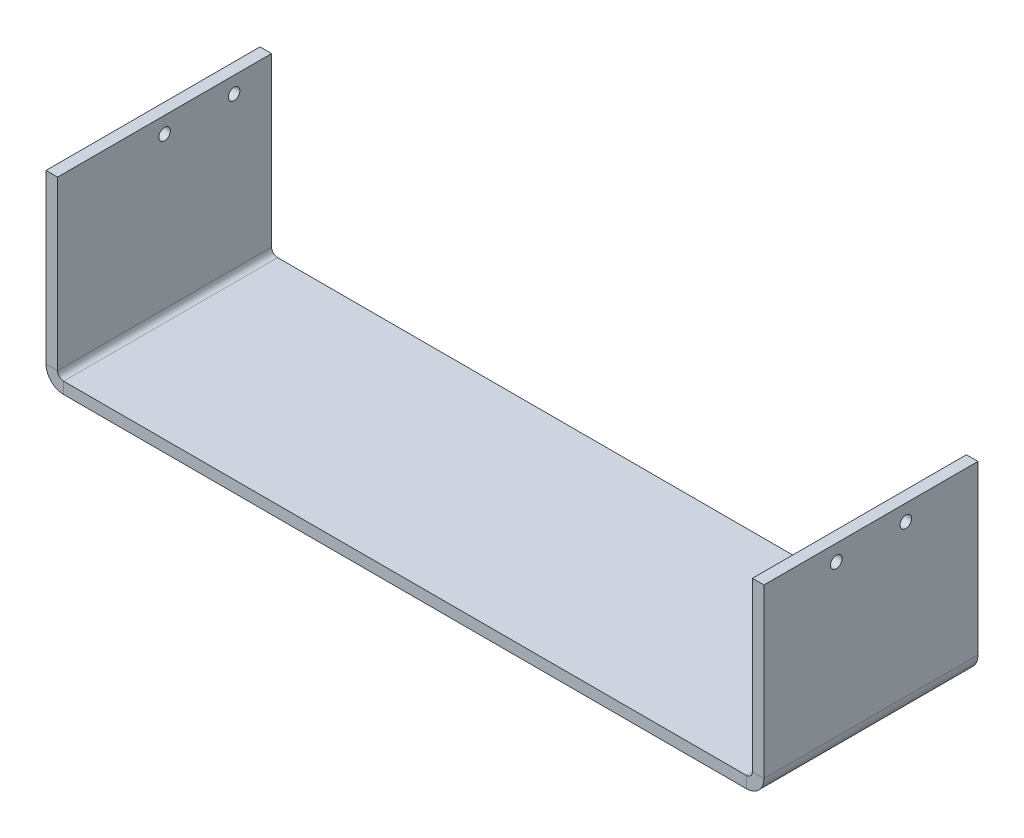
ISO-10303-21;
HEADER;
FILE_DESCRIPTION(('STEP AP214'),'2;1');
FILE_NAME('part.step','',(''),(''),'','','');
FILE_SCHEMA(('AUTOMOTIVE_DESIGN { 1 0 10303 214 1 1 1 1 }'));
ENDSEC;
DATA;
#1=APPLICATION_CONTEXT('core data for automotive mechanical design processes');
#2=APPLICATION_PROTOCOL_DEFINITION('international standard','automotive_design',2000,#1);
#3=PRODUCT_CONTEXT('',#1,'mechanical');
#4=PRODUCT('Part','Part','',(#3));
#5=PRODUCT_RELATED_PRODUCT_CATEGORY('part','',(#4));
#6=PRODUCT_DEFINITION_FORMATION('','',#4);
#7=PRODUCT_DEFINITION_CONTEXT('part definition',#1,'design');
#8=PRODUCT_DEFINITION('design','',#6,#7);
#9=PRODUCT_DEFINITION_SHAPE('','',#8);
#10=(LENGTH_UNIT() NAMED_UNIT(*) SI_UNIT(.MILLI.,.METRE.));
#11=(NAMED_UNIT(*) PLANE_ANGLE_UNIT() SI_UNIT($,.RADIAN.));
#12=(NAMED_UNIT(*) SI_UNIT($,.STERADIAN.) SOLID_ANGLE_UNIT());
#13=UNCERTAINTY_MEASURE_WITH_UNIT(LENGTH_MEASURE(1.E-05),#10,'distance_accuracy_value','');
#14=(GEOMETRIC_REPRESENTATION_CONTEXT(3) GLOBAL_UNCERTAINTY_ASSIGNED_CONTEXT((#13)) GLOBAL_UNIT_ASSIGNED_CONTEXT((#10,
#11,#12)) REPRESENTATION_CONTEXT('',''));
#15=CARTESIAN_POINT('',(0.,0.,0.));
#16=DIRECTION('',(0.,0.,1.));
#17=DIRECTION('',(1.,0.,0.));
#18=AXIS2_PLACEMENT_3D('',#15,#16,#17);
#19=CARTESIAN_POINT('',(122.4,0.,92.4));
#20=DIRECTION('',(0.,0.,1.));
#21=DIRECTION('',(1.,0.,0.));
#22=AXIS2_PLACEMENT_3D('',#19,#20,#21);
#23=PLANE('',#22);
#24=DIRECTION('',(0.,1.,0.));
#25=VECTOR('',#24,1.);
#26=CARTESIAN_POINT('',(122.4,0.,92.4));
#27=LINE('',#26,#25);
#28=CARTESIAN_POINT('',(122.4,0.,92.4));
#29=VERTEX_POINT('',#28);
#30=CARTESIAN_POINT('',(122.4,5.00000000000002,92.4));
#31=VERTEX_POINT('',#30);
#32=EDGE_CURVE('E11',#29,#31,#27,.T.);
#33=ORIENTED_EDGE('',*,*,#32,.F.);
#34=CARTESIAN_POINT('',(122.4,7.60000000000002,92.4));
#35=DIRECTION('',(0.,0.,1.));
#36=DIRECTION('',(1.,0.,0.));
#37=AXIS2_PLACEMENT_3D('',#34,#35,#36);
#38=CIRCLE('',#37,7.6);
#39=CARTESIAN_POINT('',(130.,7.60000000000002,92.4));
#40=VERTEX_POINT('',#39);
#41=EDGE_CURVE('E270',#40,#29,#38,.F.);
#42=ORIENTED_EDGE('',*,*,#41,.F.);
#43=DIRECTION('',(1.,0.,0.));
#44=VECTOR('',#43,1.);
#45=CARTESIAN_POINT('',(125.,7.60000000000002,92.4));
#46=LINE('',#45,#44);
#47=CARTESIAN_POINT('',(125.,7.60000000000002,92.4));
#48=VERTEX_POINT('',#47);
#49=EDGE_CURVE('E52',#48,#40,#46,.T.);
#50=ORIENTED_EDGE('',*,*,#49,.F.);
#51=CARTESIAN_POINT('',(122.4,7.60000000000002,92.4));
#52=DIRECTION('',(0.,0.,1.));
#53=DIRECTION('',(1.,0.,0.));
#54=AXIS2_PLACEMENT_3D('',#51,#52,#53);
#55=CIRCLE('',#54,2.6);
#56=EDGE_CURVE('E153',#48,#31,#55,.F.);
#57=ORIENTED_EDGE('',*,*,#56,.T.);
#58=EDGE_LOOP('',(#33,#42,#50,#57));
#59=FACE_BOUND('',#58,.T.);
#60=ADVANCED_FACE('F43',(#59),#23,.T.);
#61=CARTESIAN_POINT('',(125.,7.60000000000002,92.4));
#62=DIRECTION('',(0.,0.,1.));
#63=DIRECTION('',(1.,0.,0.));
#64=AXIS2_PLACEMENT_3D('',#61,#62,#63);
#65=PLANE('',#64);
#66=DIRECTION('',(-1.,0.,0.));
#67=VECTOR('',#66,1.);
#68=CARTESIAN_POINT('',(-99.9999999999999,0.,92.4));
#69=LINE('',#68,#67);
#70=CARTESIAN_POINT('',(-172.4,0.,92.4));
#71=VERTEX_POINT('',#70);
#72=EDGE_CURVE('E148',#29,#71,#69,.T.);
#73=ORIENTED_EDGE('',*,*,#72,.F.);
#74=ORIENTED_EDGE('',*,*,#32,.T.);
#75=DIRECTION('',(-1.,0.,0.));
#76=VECTOR('',#75,1.);
#77=CARTESIAN_POINT('',(130.,5.00000000000002,92.4));
#78=LINE('',#77,#76);
#79=CARTESIAN_POINT('',(-172.4,5.00000000000003,92.4));
#80=VERTEX_POINT('',#79);
#81=EDGE_CURVE('E145',#31,#80,#78,.T.);
#82=ORIENTED_EDGE('',*,*,#81,.T.);
#83=DIRECTION('',(0.,-1.,0.));
#84=VECTOR('',#83,1.);
#85=CARTESIAN_POINT('',(-172.4,5.00000000000003,92.4));
#86=LINE('',#85,#84);
#87=EDGE_CURVE('E235',#80,#71,#86,.T.);
#88=ORIENTED_EDGE('',*,*,#87,.T.);
#89=EDGE_LOOP('',(#73,#74,#82,#88));
#90=FACE_BOUND('',#89,.T.);
#91=ADVANCED_FACE('F143',(#90),#65,.T.);
#92=CARTESIAN_POINT('',(130.,7.60000000000002,0.));
#93=DIRECTION('',(0.,0.,-1.));
#94=DIRECTION('',(-1.,0.,0.));
#95=AXIS2_PLACEMENT_3D('',#92,#93,#94);
#96=PLANE('',#95);
#97=DIRECTION('',(-1.,0.,0.));
#98=VECTOR('',#97,1.);
#99=CARTESIAN_POINT('',(130.,7.60000000000002,0.));
#100=LINE('',#99,#98);
#101=CARTESIAN_POINT('',(130.,7.60000000000002,0.));
#102=VERTEX_POINT('',#101);
#103=CARTESIAN_POINT('',(125.,7.60000000000002,0.));
#104=VERTEX_POINT('',#103);
#105=EDGE_CURVE('E240',#102,#104,#100,.T.);
#106=ORIENTED_EDGE('',*,*,#105,.F.);
#107=CARTESIAN_POINT('',(122.4,7.60000000000002,0.));
#108=DIRECTION('',(0.,0.,1.));
#109=DIRECTION('',(1.,0.,0.));
#110=AXIS2_PLACEMENT_3D('',#107,#108,#109);
#111=CIRCLE('',#110,7.6);
#112=CARTESIAN_POINT('',(122.4,0.,0.));
#113=VERTEX_POINT('',#112);
#114=EDGE_CURVE('E192',#102,#113,#111,.F.);
#115=ORIENTED_EDGE('',*,*,#114,.T.);
#116=DIRECTION('',(0.,-1.,0.));
#117=VECTOR('',#116,1.);
#118=CARTESIAN_POINT('',(122.4,5.00000000000002,0.));
#119=LINE('',#118,#117);
#120=CARTESIAN_POINT('',(122.4,5.00000000000002,0.));
#121=VERTEX_POINT('',#120);
#122=EDGE_CURVE('E238',#121,#113,#119,.T.);
#123=ORIENTED_EDGE('',*,*,#122,.F.);
#124=CARTESIAN_POINT('',(122.4,7.60000000000002,0.));
#125=DIRECTION('',(0.,0.,1.));
#126=DIRECTION('',(1.,0.,0.));
#127=AXIS2_PLACEMENT_3D('',#124,#125,#126);
#128=CIRCLE('',#127,2.6);
#129=EDGE_CURVE('E165',#104,#121,#128,.F.);
#130=ORIENTED_EDGE('',*,*,#129,.F.);
#131=EDGE_LOOP('',(#106,#115,#123,#130));
#132=FACE_BOUND('',#131,.T.);
#133=ADVANCED_FACE('F289',(#132),#96,.T.);
#134=CARTESIAN_POINT('',(122.4,5.00000000000002,0.));
#135=DIRECTION('',(0.,0.,-1.));
#136=DIRECTION('',(-1.,0.,0.));
#137=AXIS2_PLACEMENT_3D('',#134,#135,#136);
#138=PLANE('',#137);
#139=DIRECTION('',(0.,-1.,0.));
#140=VECTOR('',#139,1.);
#141=CARTESIAN_POINT('',(130.,80.,0.));
#142=LINE('',#141,#140);
#143=CARTESIAN_POINT('',(130.,80.,0.));
#144=VERTEX_POINT('',#143);
#145=EDGE_CURVE('E195',#144,#102,#142,.T.);
#146=ORIENTED_EDGE('',*,*,#145,.T.);
#147=ORIENTED_EDGE('',*,*,#105,.T.);
#148=DIRECTION('',(0.,-1.,0.));
#149=VECTOR('',#148,1.);
#150=CARTESIAN_POINT('',(125.,80.,0.));
#151=LINE('',#150,#149);
#152=CARTESIAN_POINT('',(125.,80.,0.));
#153=VERTEX_POINT('',#152);
#154=EDGE_CURVE('E201',#153,#104,#151,.T.);
#155=ORIENTED_EDGE('',*,*,#154,.F.);
#156=DIRECTION('',(1.,0.,0.));
#157=VECTOR('',#156,1.);
#158=CARTESIAN_POINT('',(125.,80.,0.));
#159=LINE('',#158,#157);
#160=EDGE_CURVE('E198',#153,#144,#159,.T.);
#161=ORIENTED_EDGE('',*,*,#160,.T.);
#162=EDGE_LOOP('',(#146,#147,#155,#161));
#163=FACE_BOUND('',#162,.T.);
#164=ADVANCED_FACE('F325',(#163),#138,.T.);
#165=CARTESIAN_POINT('',(-180.,7.60000000000003,92.4));
#166=DIRECTION('',(0.,0.,1.));
#167=DIRECTION('',(1.,0.,0.));
#168=AXIS2_PLACEMENT_3D('',#165,#166,#167);
#169=PLANE('',#168);
#170=DIRECTION('',(1.,0.,0.));
#171=VECTOR('',#170,1.);
#172=CARTESIAN_POINT('',(-180.,7.60000000000003,92.4));
#173=LINE('',#172,#171);
#174=CARTESIAN_POINT('',(-180.,7.60000000000003,92.4));
#175=VERTEX_POINT('',#174);
#176=CARTESIAN_POINT('',(-175.,7.60000000000003,92.4));
#177=VERTEX_POINT('',#176);
#178=EDGE_CURVE('E61',#175,#177,#173,.T.);
#179=ORIENTED_EDGE('',*,*,#178,.F.);
#180=CARTESIAN_POINT('',(-172.4,7.60000000000003,92.4));
#181=DIRECTION('',(0.,0.,1.));
#182=DIRECTION('',(1.,0.,0.));
#183=AXIS2_PLACEMENT_3D('',#180,#181,#182);
#184=CIRCLE('',#183,7.6);
#185=EDGE_CURVE('E266',#71,#175,#184,.F.);
#186=ORIENTED_EDGE('',*,*,#185,.F.);
#187=ORIENTED_EDGE('',*,*,#87,.F.);
#188=CARTESIAN_POINT('',(-172.4,7.60000000000003,92.4));
#189=DIRECTION('',(0.,0.,1.));
#190=DIRECTION('',(1.,0.,0.));
#191=AXIS2_PLACEMENT_3D('',#188,#189,#190);
#192=CIRCLE('',#191,2.6);
#193=EDGE_CURVE('E173',#80,#177,#192,.F.);
#194=ORIENTED_EDGE('',*,*,#193,.T.);
#195=EDGE_LOOP('',(#179,#186,#187,#194));
#196=FACE_BOUND('',#195,.T.);
#197=ADVANCED_FACE('F318',(#196),#169,.T.);
#198=CARTESIAN_POINT('',(-172.4,5.00000000000003,92.4));
#199=DIRECTION('',(0.,0.,1.));
#200=DIRECTION('',(1.,0.,0.));
#201=AXIS2_PLACEMENT_3D('',#198,#199,#200);
#202=PLANE('',#201);
#203=DIRECTION('',(0.,1.,0.));
#204=VECTOR('',#203,1.);
#205=CARTESIAN_POINT('',(-180.,0.,92.4));
#206=LINE('',#205,#204);
#207=CARTESIAN_POINT('',(-180.,80.,92.4));
#208=VERTEX_POINT('',#207);
#209=EDGE_CURVE('E263',#175,#208,#206,.T.);
#210=ORIENTED_EDGE('',*,*,#209,.F.);
#211=ORIENTED_EDGE('',*,*,#178,.T.);
#212=DIRECTION('',(0.,1.,0.));
#213=VECTOR('',#212,1.);
#214=CARTESIAN_POINT('',(-175.,0.,92.4));
#215=LINE('',#214,#213);
#216=CARTESIAN_POINT('',(-175.,80.,92.4));
#217=VERTEX_POINT('',#216);
#218=EDGE_CURVE('E115',#177,#217,#215,.T.);
#219=ORIENTED_EDGE('',*,*,#218,.T.);
#220=DIRECTION('',(1.,0.,0.));
#221=VECTOR('',#220,1.);
#222=CARTESIAN_POINT('',(-180.,80.,92.4));
#223=LINE('',#222,#221);
#224=EDGE_CURVE('E260',#208,#217,#223,.T.);
#225=ORIENTED_EDGE('',*,*,#224,.F.);
#226=EDGE_LOOP('',(#210,#211,#219,#225));
#227=FACE_BOUND('',#226,.T.);
#228=ADVANCED_FACE('F316',(#227),#202,.T.);
#229=CARTESIAN_POINT('',(-172.4,0.,0.));
#230=DIRECTION('',(0.,0.,-1.));
#231=DIRECTION('',(-1.,0.,0.));
#232=AXIS2_PLACEMENT_3D('',#229,#230,#231);
#233=PLANE('',#232);
#234=DIRECTION('',(0.,1.,0.));
#235=VECTOR('',#234,1.);
#236=CARTESIAN_POINT('',(-172.4,0.,0.));
#237=LINE('',#236,#235);
#238=CARTESIAN_POINT('',(-172.4,0.,0.));
#239=VERTEX_POINT('',#238);
#240=CARTESIAN_POINT('',(-172.4,5.00000000000003,0.));
#241=VERTEX_POINT('',#240);
#242=EDGE_CURVE('E102',#239,#241,#237,.T.);
#243=ORIENTED_EDGE('',*,*,#242,.F.);
#244=CARTESIAN_POINT('',(-172.4,7.60000000000003,0.));
#245=DIRECTION('',(0.,0.,1.));
#246=DIRECTION('',(1.,0.,0.));
#247=AXIS2_PLACEMENT_3D('',#244,#245,#246);
#248=CIRCLE('',#247,7.6);
#249=CARTESIAN_POINT('',(-180.,7.60000000000003,0.));
#250=VERTEX_POINT('',#249);
#251=EDGE_CURVE('E188',#239,#250,#248,.F.);
#252=ORIENTED_EDGE('',*,*,#251,.T.);
#253=DIRECTION('',(-1.,0.,0.));
#254=VECTOR('',#253,1.);
#255=CARTESIAN_POINT('',(-175.,7.60000000000003,0.));
#256=LINE('',#255,#254);
#257=CARTESIAN_POINT('',(-175.,7.60000000000003,0.));
#258=VERTEX_POINT('',#257);
#259=EDGE_CURVE('E109',#258,#250,#256,.T.);
#260=ORIENTED_EDGE('',*,*,#259,.F.);
#261=CARTESIAN_POINT('',(-172.4,7.60000000000003,0.));
#262=DIRECTION('',(0.,0.,1.));
#263=DIRECTION('',(1.,0.,0.));
#264=AXIS2_PLACEMENT_3D('',#261,#262,#263);
#265=CIRCLE('',#264,2.6);
#266=EDGE_CURVE('E207',#241,#258,#265,.F.);
#267=ORIENTED_EDGE('',*,*,#266,.F.);
#268=EDGE_LOOP('',(#243,#252,#260,#267));
#269=FACE_BOUND('',#268,.T.);
#270=ADVANCED_FACE('F295',(#269),#233,.T.);
#271=CARTESIAN_POINT('',(-175.,7.60000000000003,0.));
#272=DIRECTION('',(0.,0.,-1.));
#273=DIRECTION('',(-1.,0.,0.));
#274=AXIS2_PLACEMENT_3D('',#271,#272,#273);
#275=PLANE('',#274);
#276=DIRECTION('',(-1.,0.,0.));
#277=VECTOR('',#276,1.);
#278=CARTESIAN_POINT('',(130.,0.,0.));
#279=LINE('',#278,#277);
#280=EDGE_CURVE('E190',#113,#239,#279,.T.);
#281=ORIENTED_EDGE('',*,*,#280,.T.);
#282=ORIENTED_EDGE('',*,*,#242,.T.);
#283=DIRECTION('',(1.,0.,0.));
#284=VECTOR('',#283,1.);
#285=CARTESIAN_POINT('',(-99.9999999999999,5.00000000000003,0.));
#286=LINE('',#285,#284);
#287=EDGE_CURVE('E205',#121,#241,#286,.F.);
#288=ORIENTED_EDGE('',*,*,#287,.F.);
#289=ORIENTED_EDGE('',*,*,#122,.T.);
#290=EDGE_LOOP('',(#281,#282,#288,#289));
#291=FACE_BOUND('',#290,.T.);
#292=ADVANCED_FACE('F291',(#291),#275,.T.);
#293=CARTESIAN_POINT('',(-175.,0.,92.4));
#294=DIRECTION('',(-1.,0.,0.));
#295=DIRECTION('',(0.,0.,1.));
#296=AXIS2_PLACEMENT_3D('',#293,#294,#295);
#297=PLANE('',#296);
#298=CARTESIAN_POINT('',(-175.,73.,16.2));
#299=DIRECTION('',(-1.,0.,0.));
#300=DIRECTION('',(0.,0.,1.));
#301=AXIS2_PLACEMENT_3D('',#298,#299,#300);
#302=CIRCLE('',#301,2.5);
#303=CARTESIAN_POINT('',(-175.,73.,18.7));
#304=VERTEX_POINT('',#303);
#305=EDGE_CURVE('E254',#304,#304,#302,.T.);
#306=ORIENTED_EDGE('',*,*,#305,.T.);
#307=EDGE_LOOP('',(#306));
#308=FACE_BOUND('',#307,.T.);
#309=CARTESIAN_POINT('',(-175.,73.,46.2));
#310=DIRECTION('',(-1.,0.,0.));
#311=DIRECTION('',(0.,0.,1.));
#312=AXIS2_PLACEMENT_3D('',#309,#310,#311);
#313=CIRCLE('',#312,2.5);
#314=CARTESIAN_POINT('',(-175.,73.,48.7));
#315=VERTEX_POINT('',#314);
#316=EDGE_CURVE('E616',#315,#315,#313,.T.);
#317=ORIENTED_EDGE('',*,*,#316,.T.);
#318=EDGE_LOOP('',(#317));
#319=FACE_BOUND('',#318,.T.);
#320=DIRECTION('',(0.,1.,0.));
#321=VECTOR('',#320,1.);
#322=CARTESIAN_POINT('',(-175.,0.,0.));
#323=LINE('',#322,#321);
#324=CARTESIAN_POINT('',(-175.,80.,0.));
#325=VERTEX_POINT('',#324);
#326=EDGE_CURVE('E179',#258,#325,#323,.T.);
#327=ORIENTED_EDGE('',*,*,#326,.T.);
#328=DIRECTION('',(0.,0.,-1.));
#329=VECTOR('',#328,1.);
#330=CARTESIAN_POINT('',(-175.,80.,92.4));
#331=LINE('',#330,#329);
#332=EDGE_CURVE('E231',#217,#325,#331,.T.);
#333=ORIENTED_EDGE('',*,*,#332,.F.);
#334=ORIENTED_EDGE('',*,*,#218,.F.);
#335=DIRECTION('',(0.,0.,-1.));
#336=VECTOR('',#335,1.);
#337=CARTESIAN_POINT('',(-175.,7.60000000000003,92.4));
#338=LINE('',#337,#336);
#339=EDGE_CURVE('E175',#177,#258,#338,.T.);
#340=ORIENTED_EDGE('',*,*,#339,.T.);
#341=EDGE_LOOP('',(#327,#333,#334,#340));
#342=FACE_BOUND('',#341,.T.);
#343=ADVANCED_FACE('F313',(#308,#319,#342),#297,.F.);
#344=CARTESIAN_POINT('',(-180.,80.,92.4));
#345=DIRECTION('',(0.,1.,0.));
#346=DIRECTION('',(0.,0.,1.));
#347=AXIS2_PLACEMENT_3D('',#344,#345,#346);
#348=PLANE('',#347);
#349=DIRECTION('',(1.,0.,0.));
#350=VECTOR('',#349,1.);
#351=CARTESIAN_POINT('',(-180.,80.,0.));
#352=LINE('',#351,#350);
#353=CARTESIAN_POINT('',(-180.,80.,0.));
#354=VERTEX_POINT('',#353);
#355=EDGE_CURVE('E182',#354,#325,#352,.T.);
#356=ORIENTED_EDGE('',*,*,#355,.F.);
#357=DIRECTION('',(0.,0.,-1.));
#358=VECTOR('',#357,1.);
#359=CARTESIAN_POINT('',(-180.,80.,92.4));
#360=LINE('',#359,#358);
#361=EDGE_CURVE('E229',#208,#354,#360,.T.);
#362=ORIENTED_EDGE('',*,*,#361,.F.);
#363=ORIENTED_EDGE('',*,*,#224,.T.);
#364=ORIENTED_EDGE('',*,*,#332,.T.);
#365=EDGE_LOOP('',(#356,#362,#363,#364));
#366=FACE_BOUND('',#365,.T.);
#367=ADVANCED_FACE('F315',(#366),#348,.T.);
#368=CARTESIAN_POINT('',(-180.,0.,92.4));
#369=DIRECTION('',(-1.,0.,0.));
#370=DIRECTION('',(0.,0.,1.));
#371=AXIS2_PLACEMENT_3D('',#368,#369,#370);
#372=PLANE('',#371);
#373=CARTESIAN_POINT('',(-180.,73.,16.2));
#374=DIRECTION('',(-1.,0.,0.));
#375=DIRECTION('',(0.,0.,1.));
#376=AXIS2_PLACEMENT_3D('',#373,#374,#375);
#377=CIRCLE('',#376,2.5);
#378=CARTESIAN_POINT('',(-180.,73.,18.7));
#379=VERTEX_POINT('',#378);
#380=EDGE_CURVE('E613',#379,#379,#377,.T.);
#381=ORIENTED_EDGE('',*,*,#380,.F.);
#382=EDGE_LOOP('',(#381));
#383=FACE_BOUND('',#382,.T.);
#384=CARTESIAN_POINT('',(-180.,73.,46.2));
#385=DIRECTION('',(-1.,0.,0.));
#386=DIRECTION('',(0.,0.,1.));
#387=AXIS2_PLACEMENT_3D('',#384,#385,#386);
#388=CIRCLE('',#387,2.5);
#389=CARTESIAN_POINT('',(-180.,73.,48.7));
#390=VERTEX_POINT('',#389);
#391=EDGE_CURVE('E620',#390,#390,#388,.T.);
#392=ORIENTED_EDGE('',*,*,#391,.F.);
#393=EDGE_LOOP('',(#392));
#394=FACE_BOUND('',#393,.T.);
#395=DIRECTION('',(0.,1.,0.));
#396=VECTOR('',#395,1.);
#397=CARTESIAN_POINT('',(-180.,0.,0.));
#398=LINE('',#397,#396);
#399=EDGE_CURVE('E185',#250,#354,#398,.T.);
#400=ORIENTED_EDGE('',*,*,#399,.F.);
#401=DIRECTION('',(0.,0.,-1.));
#402=VECTOR('',#401,1.);
#403=CARTESIAN_POINT('',(-180.,7.60000000000003,92.4));
#404=LINE('',#403,#402);
#405=EDGE_CURVE('E226',#175,#250,#404,.T.);
#406=ORIENTED_EDGE('',*,*,#405,.F.);
#407=ORIENTED_EDGE('',*,*,#209,.T.);
#408=ORIENTED_EDGE('',*,*,#361,.T.);
#409=EDGE_LOOP('',(#400,#406,#407,#408));
#410=FACE_BOUND('',#409,.T.);
#411=ADVANCED_FACE('F307',(#383,#394,#410),#372,.T.);
#412=CARTESIAN_POINT('',(-172.4,7.60000000000003,92.4));
#413=DIRECTION('',(0.,0.,-1.));
#414=DIRECTION('',(-1.,0.,0.));
#415=AXIS2_PLACEMENT_3D('',#412,#413,#414);
#416=CYLINDRICAL_SURFACE('',#415,7.6);
#417=ORIENTED_EDGE('',*,*,#251,.F.);
#418=DIRECTION('',(0.,0.,-1.));
#419=VECTOR('',#418,1.);
#420=CARTESIAN_POINT('',(-172.4,0.,92.4));
#421=LINE('',#420,#419);
#422=EDGE_CURVE('E223',#71,#239,#421,.T.);
#423=ORIENTED_EDGE('',*,*,#422,.F.);
#424=ORIENTED_EDGE('',*,*,#185,.T.);
#425=ORIENTED_EDGE('',*,*,#405,.T.);
#426=EDGE_LOOP('',(#417,#423,#424,#425));
#427=FACE_BOUND('',#426,.T.);
#428=ADVANCED_FACE('F303',(#427),#416,.T.);
#429=CARTESIAN_POINT('',(130.,0.,92.4));
#430=DIRECTION('',(0.,-1.,0.));
#431=DIRECTION('',(1.,0.,0.));
#432=AXIS2_PLACEMENT_3D('',#429,#430,#431);
#433=PLANE('',#432);
#434=ORIENTED_EDGE('',*,*,#280,.F.);
#435=DIRECTION('',(0.,0.,-1.));
#436=VECTOR('',#435,1.);
#437=CARTESIAN_POINT('',(122.4,0.,92.4));
#438=LINE('',#437,#436);
#439=EDGE_CURVE('E220',#29,#113,#438,.T.);
#440=ORIENTED_EDGE('',*,*,#439,.F.);
#441=ORIENTED_EDGE('',*,*,#72,.T.);
#442=ORIENTED_EDGE('',*,*,#422,.T.);
#443=EDGE_LOOP('',(#434,#440,#441,#442));
#444=FACE_BOUND('',#443,.T.);
#445=ADVANCED_FACE('F300',(#444),#433,.T.);
#446=CARTESIAN_POINT('',(122.4,7.60000000000002,92.4));
#447=DIRECTION('',(0.,0.,-1.));
#448=DIRECTION('',(-1.,0.,0.));
#449=AXIS2_PLACEMENT_3D('',#446,#447,#448);
#450=CYLINDRICAL_SURFACE('',#449,7.6);
#451=ORIENTED_EDGE('',*,*,#114,.F.);
#452=DIRECTION('',(0.,0.,-1.));
#453=VECTOR('',#452,1.);
#454=CARTESIAN_POINT('',(130.,7.60000000000002,92.4));
#455=LINE('',#454,#453);
#456=EDGE_CURVE('E217',#40,#102,#455,.T.);
#457=ORIENTED_EDGE('',*,*,#456,.F.);
#458=ORIENTED_EDGE('',*,*,#41,.T.);
#459=ORIENTED_EDGE('',*,*,#439,.T.);
#460=EDGE_LOOP('',(#451,#457,#458,#459));
#461=FACE_BOUND('',#460,.T.);
#462=ADVANCED_FACE('F346',(#461),#450,.T.);
#463=CARTESIAN_POINT('',(130.,80.,92.4));
#464=DIRECTION('',(1.,0.,0.));
#465=DIRECTION('',(0.,1.,0.));
#466=AXIS2_PLACEMENT_3D('',#463,#464,#465);
#467=PLANE('',#466);
#468=CARTESIAN_POINT('',(130.,73.,61.2));
#469=DIRECTION('',(1.,0.,0.));
#470=DIRECTION('',(0.,1.,0.));
#471=AXIS2_PLACEMENT_3D('',#468,#469,#470);
#472=CIRCLE('',#471,2.5);
#473=CARTESIAN_POINT('',(130.,75.5,61.2));
#474=VERTEX_POINT('',#473);
#475=EDGE_CURVE('E244',#474,#474,#472,.T.);
#476=ORIENTED_EDGE('',*,*,#475,.F.);
#477=EDGE_LOOP('',(#476));
#478=FACE_BOUND('',#477,.T.);
#479=CARTESIAN_POINT('',(130.,73.,31.2));
#480=DIRECTION('',(1.,0.,0.));
#481=DIRECTION('',(0.,1.,0.));
#482=AXIS2_PLACEMENT_3D('',#479,#480,#481);
#483=CIRCLE('',#482,2.5);
#484=CARTESIAN_POINT('',(130.,75.5,31.2));
#485=VERTEX_POINT('',#484);
#486=EDGE_CURVE('E249',#485,#485,#483,.T.);
#487=ORIENTED_EDGE('',*,*,#486,.F.);
#488=EDGE_LOOP('',(#487));
#489=FACE_BOUND('',#488,.T.);
#490=ORIENTED_EDGE('',*,*,#145,.F.);
#491=DIRECTION('',(0.,0.,-1.));
#492=VECTOR('',#491,1.);
#493=CARTESIAN_POINT('',(130.,80.,92.4));
#494=LINE('',#493,#492);
#495=CARTESIAN_POINT('',(130.,80.,92.4));
#496=VERTEX_POINT('',#495);
#497=EDGE_CURVE('E215',#496,#144,#494,.T.);
#498=ORIENTED_EDGE('',*,*,#497,.F.);
#499=DIRECTION('',(0.,-1.,0.));
#500=VECTOR('',#499,1.);
#501=CARTESIAN_POINT('',(130.,80.,92.4));
#502=LINE('',#501,#500);
#503=EDGE_CURVE('E273',#496,#40,#502,.T.);
#504=ORIENTED_EDGE('',*,*,#503,.T.);
#505=ORIENTED_EDGE('',*,*,#456,.T.);
#506=EDGE_LOOP('',(#490,#498,#504,#505));
#507=FACE_BOUND('',#506,.T.);
#508=ADVANCED_FACE('F344',(#478,#489,#507),#467,.T.);
#509=CARTESIAN_POINT('',(125.,80.,92.4));
#510=DIRECTION('',(0.,1.,0.));
#511=DIRECTION('',(0.,0.,1.));
#512=AXIS2_PLACEMENT_3D('',#509,#510,#511);
#513=PLANE('',#512);
#514=ORIENTED_EDGE('',*,*,#160,.F.);
#515=DIRECTION('',(0.,0.,-1.));
#516=VECTOR('',#515,1.);
#517=CARTESIAN_POINT('',(125.,80.,92.4));
#518=LINE('',#517,#516);
#519=CARTESIAN_POINT('',(125.,80.,92.4));
#520=VERTEX_POINT('',#519);
#521=EDGE_CURVE('E213',#520,#153,#518,.T.);
#522=ORIENTED_EDGE('',*,*,#521,.F.);
#523=DIRECTION('',(1.,0.,0.));
#524=VECTOR('',#523,1.);
#525=CARTESIAN_POINT('',(125.,80.,92.4));
#526=LINE('',#525,#524);
#527=EDGE_CURVE('E276',#520,#496,#526,.T.);
#528=ORIENTED_EDGE('',*,*,#527,.T.);
#529=ORIENTED_EDGE('',*,*,#497,.T.);
#530=EDGE_LOOP('',(#514,#522,#528,#529));
#531=FACE_BOUND('',#530,.T.);
#532=ADVANCED_FACE('F354',(#531),#513,.T.);
#533=CARTESIAN_POINT('',(125.,80.,92.4));
#534=DIRECTION('',(1.,0.,0.));
#535=DIRECTION('',(0.,1.,0.));
#536=AXIS2_PLACEMENT_3D('',#533,#534,#535);
#537=PLANE('',#536);
#538=CARTESIAN_POINT('',(125.,73.,61.2));
#539=DIRECTION('',(1.,0.,0.));
#540=DIRECTION('',(0.,1.,0.));
#541=AXIS2_PLACEMENT_3D('',#538,#539,#540);
#542=CIRCLE('',#541,2.5);
#543=CARTESIAN_POINT('',(125.,75.5,61.2));
#544=VERTEX_POINT('',#543);
#545=EDGE_CURVE('E46',#544,#544,#542,.T.);
#546=ORIENTED_EDGE('',*,*,#545,.T.);
#547=EDGE_LOOP('',(#546));
#548=FACE_BOUND('',#547,.T.);
#549=CARTESIAN_POINT('',(125.,73.,31.2));
#550=DIRECTION('',(1.,0.,0.));
#551=DIRECTION('',(0.,1.,0.));
#552=AXIS2_PLACEMENT_3D('',#549,#550,#551);
#553=CIRCLE('',#552,2.5);
#554=CARTESIAN_POINT('',(125.,75.5,31.2));
#555=VERTEX_POINT('',#554);
#556=EDGE_CURVE('E242',#555,#555,#553,.T.);
#557=ORIENTED_EDGE('',*,*,#556,.T.);
#558=EDGE_LOOP('',(#557));
#559=FACE_BOUND('',#558,.T.);
#560=ORIENTED_EDGE('',*,*,#154,.T.);
#561=DIRECTION('',(0.,0.,-1.));
#562=VECTOR('',#561,1.);
#563=CARTESIAN_POINT('',(125.,7.60000000000002,92.4));
#564=LINE('',#563,#562);
#565=EDGE_CURVE('E167',#48,#104,#564,.T.);
#566=ORIENTED_EDGE('',*,*,#565,.F.);
#567=DIRECTION('',(0.,-1.,0.));
#568=VECTOR('',#567,1.);
#569=CARTESIAN_POINT('',(125.,80.,92.4));
#570=LINE('',#569,#568);
#571=EDGE_CURVE('E158',#520,#48,#570,.T.);
#572=ORIENTED_EDGE('',*,*,#571,.F.);
#573=ORIENTED_EDGE('',*,*,#521,.T.);
#574=EDGE_LOOP('',(#560,#566,#572,#573));
#575=FACE_BOUND('',#574,.T.);
#576=ADVANCED_FACE('F286',(#548,#559,#575),#537,.F.);
#577=CARTESIAN_POINT('',(122.4,7.60000000000002,92.4));
#578=DIRECTION('',(0.,0.,-1.));
#579=DIRECTION('',(-1.,0.,0.));
#580=AXIS2_PLACEMENT_3D('',#577,#578,#579);
#581=CYLINDRICAL_SURFACE('',#580,2.6);
#582=ORIENTED_EDGE('',*,*,#129,.T.);
#583=DIRECTION('',(0.,0.,-1.));
#584=VECTOR('',#583,1.);
#585=CARTESIAN_POINT('',(122.4,5.00000000000002,92.4));
#586=LINE('',#585,#584);
#587=EDGE_CURVE('E162',#31,#121,#586,.T.);
#588=ORIENTED_EDGE('',*,*,#587,.F.);
#589=ORIENTED_EDGE('',*,*,#56,.F.);
#590=ORIENTED_EDGE('',*,*,#565,.T.);
#591=EDGE_LOOP('',(#582,#588,#589,#590));
#592=FACE_BOUND('',#591,.T.);
#593=ADVANCED_FACE('F163',(#592),#581,.F.);
#594=CARTESIAN_POINT('',(-99.9999999999999,5.00000000000003,92.4));
#595=DIRECTION('',(0.,-1.,0.));
#596=DIRECTION('',(0.,0.,-1.));
#597=AXIS2_PLACEMENT_3D('',#594,#595,#596);
#598=PLANE('',#597);
#599=ORIENTED_EDGE('',*,*,#287,.T.);
#600=DIRECTION('',(0.,0.,-1.));
#601=VECTOR('',#600,1.);
#602=CARTESIAN_POINT('',(-172.4,5.00000000000003,92.4));
#603=LINE('',#602,#601);
#604=EDGE_CURVE('E168',#80,#241,#603,.T.);
#605=ORIENTED_EDGE('',*,*,#604,.F.);
#606=ORIENTED_EDGE('',*,*,#81,.F.);
#607=ORIENTED_EDGE('',*,*,#587,.T.);
#608=EDGE_LOOP('',(#599,#605,#606,#607));
#609=FACE_BOUND('',#608,.T.);
#610=ADVANCED_FACE('F170',(#609),#598,.F.);
#611=CARTESIAN_POINT('',(-172.4,7.60000000000003,92.4));
#612=DIRECTION('',(0.,0.,-1.));
#613=DIRECTION('',(-1.,0.,0.));
#614=AXIS2_PLACEMENT_3D('',#611,#612,#613);
#615=CYLINDRICAL_SURFACE('',#614,2.6);
#616=ORIENTED_EDGE('',*,*,#266,.T.);
#617=ORIENTED_EDGE('',*,*,#339,.F.);
#618=ORIENTED_EDGE('',*,*,#193,.F.);
#619=ORIENTED_EDGE('',*,*,#604,.T.);
#620=EDGE_LOOP('',(#616,#617,#618,#619));
#621=FACE_BOUND('',#620,.T.);
#622=ADVANCED_FACE('F293',(#621),#615,.F.);
#623=CARTESIAN_POINT('',(-172.4,7.60000000000003,92.4));
#624=DIRECTION('',(0.,0.,1.));
#625=DIRECTION('',(1.,0.,0.));
#626=AXIS2_PLACEMENT_3D('',#623,#624,#625);
#627=PLANE('',#626);
#628=ORIENTED_EDGE('',*,*,#571,.T.);
#629=ORIENTED_EDGE('',*,*,#49,.T.);
#630=ORIENTED_EDGE('',*,*,#503,.F.);
#631=ORIENTED_EDGE('',*,*,#527,.F.);
#632=EDGE_LOOP('',(#628,#629,#630,#631));
#633=FACE_BOUND('',#632,.T.);
#634=ADVANCED_FACE('F282',(#633),#627,.T.);
#635=CARTESIAN_POINT('',(-172.4,7.60000000000003,0.));
#636=DIRECTION('',(0.,0.,1.));
#637=DIRECTION('',(1.,0.,0.));
#638=AXIS2_PLACEMENT_3D('',#635,#636,#637);
#639=PLANE('',#638);
#640=ORIENTED_EDGE('',*,*,#326,.F.);
#641=ORIENTED_EDGE('',*,*,#259,.T.);
#642=ORIENTED_EDGE('',*,*,#399,.T.);
#643=ORIENTED_EDGE('',*,*,#355,.T.);
#644=EDGE_LOOP('',(#640,#641,#642,#643));
#645=FACE_BOUND('',#644,.T.);
#646=ADVANCED_FACE('F311',(#645),#639,.F.);
#647=CARTESIAN_POINT('',(120.,73.,31.2));
#648=DIRECTION('',(1.,0.,0.));
#649=DIRECTION('',(0.,1.,0.));
#650=AXIS2_PLACEMENT_3D('',#647,#648,#649);
#651=CYLINDRICAL_SURFACE('',#650,2.5);
#652=ORIENTED_EDGE('',*,*,#486,.T.);
#653=EDGE_LOOP('',(#652));
#654=FACE_BOUND('',#653,.T.);
#655=ORIENTED_EDGE('',*,*,#556,.F.);
#656=EDGE_LOOP('',(#655));
#657=FACE_BOUND('',#656,.T.);
#658=ADVANCED_FACE('F478',(#654,#657),#651,.F.);
#659=CARTESIAN_POINT('',(120.,73.,61.2));
#660=DIRECTION('',(1.,0.,0.));
#661=DIRECTION('',(0.,1.,0.));
#662=AXIS2_PLACEMENT_3D('',#659,#660,#661);
#663=CYLINDRICAL_SURFACE('',#662,2.5);
#664=ORIENTED_EDGE('',*,*,#475,.T.);
#665=EDGE_LOOP('',(#664));
#666=FACE_BOUND('',#665,.T.);
#667=ORIENTED_EDGE('',*,*,#545,.F.);
#668=EDGE_LOOP('',(#667));
#669=FACE_BOUND('',#668,.T.);
#670=ADVANCED_FACE('F487',(#666,#669),#663,.F.);
#671=CARTESIAN_POINT('',(-170.,73.,46.2));
#672=DIRECTION('',(-1.,0.,0.));
#673=DIRECTION('',(0.,0.,1.));
#674=AXIS2_PLACEMENT_3D('',#671,#672,#673);
#675=CYLINDRICAL_SURFACE('',#674,2.5);
#676=ORIENTED_EDGE('',*,*,#391,.T.);
#677=EDGE_LOOP('',(#676));
#678=FACE_BOUND('',#677,.T.);
#679=ORIENTED_EDGE('',*,*,#316,.F.);
#680=EDGE_LOOP('',(#679));
#681=FACE_BOUND('',#680,.T.);
#682=ADVANCED_FACE('F498',(#678,#681),#675,.F.);
#683=CARTESIAN_POINT('',(-170.,73.,16.2));
#684=DIRECTION('',(-1.,0.,0.));
#685=DIRECTION('',(0.,0.,1.));
#686=AXIS2_PLACEMENT_3D('',#683,#684,#685);
#687=CYLINDRICAL_SURFACE('',#686,2.5);
#688=ORIENTED_EDGE('',*,*,#380,.T.);
#689=EDGE_LOOP('',(#688));
#690=FACE_BOUND('',#689,.T.);
#691=ORIENTED_EDGE('',*,*,#305,.F.);
#692=EDGE_LOOP('',(#691));
#693=FACE_BOUND('',#692,.T.);
#694=ADVANCED_FACE('F508',(#690,#693),#687,.F.);
#695=CLOSED_SHELL('',(#60,#91,#133,#164,#197,#228,#270,#292,#343,#367,#411,#428,#445,#462,#508,
#532,#576,#593,#610,#622,#634,#646,#658,#670,#682,#694));
#696=MANIFOLD_SOLID_BREP('B2',#695);
#697=ADVANCED_BREP_SHAPE_REPRESENTATION('',(#18,#696),#14);
#698=SHAPE_DEFINITION_REPRESENTATION(#9,#697);
ENDSEC;
END-ISO-10303-21;
